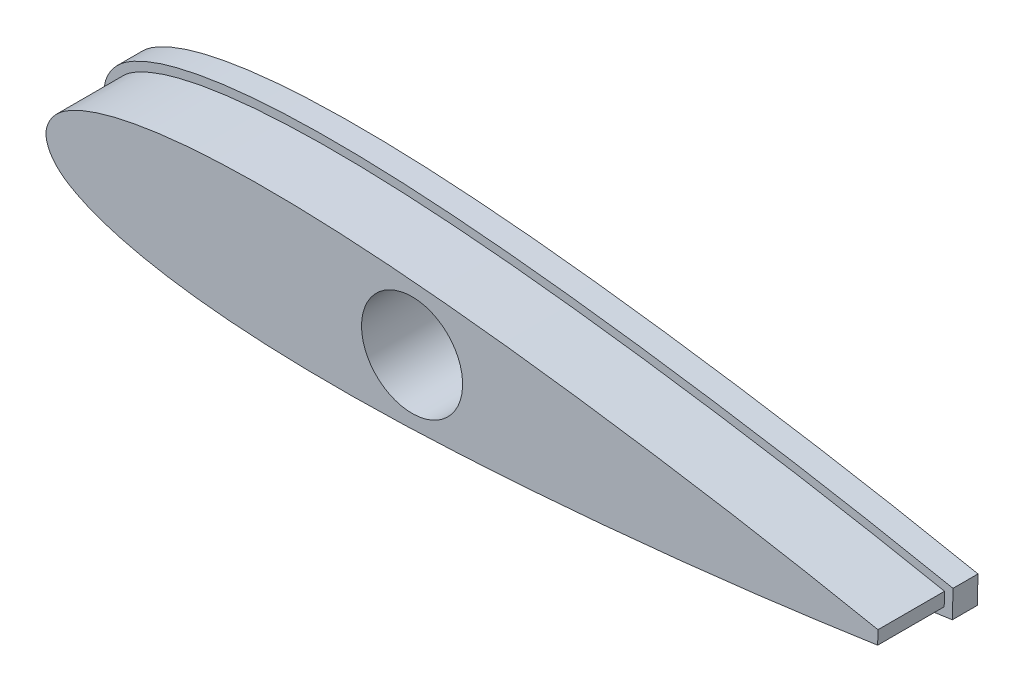
ISO-10303-21;
HEADER;
FILE_DESCRIPTION(('STEP AP214'),'2;1');
FILE_NAME('part.step','',(''),(''),'','','');
FILE_SCHEMA(('AUTOMOTIVE_DESIGN { 1 0 10303 214 1 1 1 1 }'));
ENDSEC;
DATA;
#1=APPLICATION_CONTEXT('core data for automotive mechanical design processes');
#2=APPLICATION_PROTOCOL_DEFINITION('international standard','automotive_design',2000,#1);
#3=PRODUCT_CONTEXT('',#1,'mechanical');
#4=PRODUCT('Part','Part','',(#3));
#5=PRODUCT_RELATED_PRODUCT_CATEGORY('part','',(#4));
#6=PRODUCT_DEFINITION_FORMATION('','',#4);
#7=PRODUCT_DEFINITION_CONTEXT('part definition',#1,'design');
#8=PRODUCT_DEFINITION('design','',#6,#7);
#9=PRODUCT_DEFINITION_SHAPE('','',#8);
#10=(LENGTH_UNIT() NAMED_UNIT(*) SI_UNIT(.MILLI.,.METRE.));
#11=(NAMED_UNIT(*) PLANE_ANGLE_UNIT() SI_UNIT($,.RADIAN.));
#12=(NAMED_UNIT(*) SI_UNIT($,.STERADIAN.) SOLID_ANGLE_UNIT());
#13=UNCERTAINTY_MEASURE_WITH_UNIT(LENGTH_MEASURE(1.E-05),#10,'distance_accuracy_value','');
#14=(GEOMETRIC_REPRESENTATION_CONTEXT(3) GLOBAL_UNCERTAINTY_ASSIGNED_CONTEXT((#13)) GLOBAL_UNIT_ASSIGNED_CONTEXT((#10,
#11,#12)) REPRESENTATION_CONTEXT('',''));
#15=CARTESIAN_POINT('',(0.,0.,0.));
#16=DIRECTION('',(0.,0.,1.));
#17=DIRECTION('',(1.,0.,0.));
#18=AXIS2_PLACEMENT_3D('',#15,#16,#17);
#19=CARTESIAN_POINT('',(50.0391351963758,-0.93465045998398,8.));
#20=CARTESIAN_POINT('',(45.8735654226045,-0.109554208683025,8.));
#21=CARTESIAN_POINT('',(37.5324766993359,1.4914977864518,8.));
#22=CARTESIAN_POINT('',(24.9619659066655,3.57622377755545,8.));
#23=CARTESIAN_POINT('',(12.3528740709345,5.41256621364044,8.));
#24=CARTESIAN_POINT('',(-0.303978478214954,6.93325535590916,8.));
#25=CARTESIAN_POINT('',(-10.9005845501203,7.83790789579574,8.));
#26=CARTESIAN_POINT('',(-19.410170070986,8.20760131311207,8.));
#27=CARTESIAN_POINT('',(-25.8062625672368,8.2564032276951,8.));
#28=CARTESIAN_POINT('',(-31.1435581397761,8.03732263119962,8.));
#29=CARTESIAN_POINT('',(-35.4087615230218,7.6384426647758,8.));
#30=CARTESIAN_POINT('',(-38.6026527514809,7.19302608164895,8.));
#31=CARTESIAN_POINT('',(-41.7752995956353,6.55510114662252,8.));
#32=CARTESIAN_POINT('',(-44.3969141822974,5.79731373428159,8.));
#33=CARTESIAN_POINT('',(-46.4497416142304,4.91218647077529,8.));
#34=CARTESIAN_POINT('',(-47.9189969759881,4.11222674841642,8.));
#35=CARTESIAN_POINT('',(-49.3618619362066,2.8010449640594,8.));
#36=CARTESIAN_POINT('',(-50.2398518230499,0.770607995901365,8.));
#37=CARTESIAN_POINT('',(-49.4651472544591,-1.30143769724024,8.));
#38=CARTESIAN_POINT('',(-48.0900898244585,-2.68356433009845,8.));
#39=CARTESIAN_POINT('',(-46.6629503763209,-3.55644454583241,8.));
#40=CARTESIAN_POINT('',(-44.6572638689059,-4.54375015802786,8.));
#41=CARTESIAN_POINT('',(-42.0771029667931,-5.4324990103534,8.));
#42=CARTESIAN_POINT('',(-38.9405763404005,-6.22926556486122,8.));
#43=CARTESIAN_POINT('',(-35.7731450895972,-6.8348366863545,8.));
#44=CARTESIAN_POINT('',(-31.5334171623615,-7.44783932181592,8.));
#45=CARTESIAN_POINT('',(-26.2139076378241,-7.93521879898396,8.));
#46=CARTESIAN_POINT('',(-19.8234625329192,-8.20833454122373,8.));
#47=CARTESIAN_POINT('',(-11.3060544799891,-8.26731775592366,8.));
#48=CARTESIAN_POINT('',(-0.677350383170464,-7.8970399097958,8.));
#49=CARTESIAN_POINT('',(12.0399894787811,-7.01517894913061,8.));
#50=CARTESIAN_POINT('',(24.7255130284685,-5.81566123988733,8.));
#51=CARTESIAN_POINT('',(37.3850032465093,-4.36613322499501,8.));
#52=CARTESIAN_POINT('',(45.7960907899984,-3.18683897997931,8.));
#53=CARTESIAN_POINT('',(49.9979026684139,-2.57240240678935,8.));
#54=B_SPLINE_CURVE_WITH_KNOTS('',3,(#19,#20,#21,#22,#23,#24,#25,#26,#27,#28,#29,#30,#31,#32,#33,
#34,#35,#36,#37,#38,#39,#40,#41,#42,#43,#44,#45,#46,#47,#48,#49,#50,#51,#52,#53),.UNSPECIFIED.,
.F.,.F.,(4,1,1,1,1,1,1,1,1,1,1,1,1,1,1,1,1,1,1,1,1,1,1,1,1,1,1,1,1,1,1,1,4),
(-0.00328090173750234,0.0596292109796854,0.122539323696873,0.185449436414061,0.248359549131249,
0.311269661848436,0.34272471820703,0.374179774565624,0.405634830924218,0.421362359103515,
0.437089887282812,0.452817415462109,0.468544943641406,0.476408707731054,0.484272471820703,
0.492136235910351,0.5,0.507863764089648,0.515727528179296,0.523591292268945,0.531455056358593,
0.54718258453789,0.562910112717187,0.578637640896484,0.594365169075781,0.625820225434375,
0.657275281792969,0.688730338151563,0.75164045086875,0.814550563585938,0.877460676303126,
0.940370789020314,1.0032809017375),.UNSPECIFIED.);
#55=DIRECTION('',(0.,0.,-1.));
#56=VECTOR('',#55,1.);
#57=SURFACE_OF_LINEAR_EXTRUSION('',#54,#56);
#58=CARTESIAN_POINT('',(50.0391351963758,-0.93465045998398,0.));
#59=CARTESIAN_POINT('',(45.8735654226045,-0.109554208683025,0.));
#60=CARTESIAN_POINT('',(37.5324766993359,1.4914977864518,0.));
#61=CARTESIAN_POINT('',(24.9619659066655,3.57622377755545,0.));
#62=CARTESIAN_POINT('',(12.3528740709345,5.41256621364044,0.));
#63=CARTESIAN_POINT('',(-0.303978478214954,6.93325535590916,0.));
#64=CARTESIAN_POINT('',(-10.9005845501203,7.83790789579574,0.));
#65=CARTESIAN_POINT('',(-19.410170070986,8.20760131311207,0.));
#66=CARTESIAN_POINT('',(-25.8062625672368,8.2564032276951,0.));
#67=CARTESIAN_POINT('',(-31.1435581397761,8.03732263119962,0.));
#68=CARTESIAN_POINT('',(-35.4087615230218,7.6384426647758,0.));
#69=CARTESIAN_POINT('',(-38.6026527514809,7.19302608164895,0.));
#70=CARTESIAN_POINT('',(-41.7752995956353,6.55510114662252,0.));
#71=CARTESIAN_POINT('',(-44.3969141822974,5.79731373428159,0.));
#72=CARTESIAN_POINT('',(-46.4497416142304,4.91218647077529,0.));
#73=CARTESIAN_POINT('',(-47.9189969759881,4.11222674841642,0.));
#74=CARTESIAN_POINT('',(-49.3618619362066,2.8010449640594,0.));
#75=CARTESIAN_POINT('',(-50.2398518230499,0.770607995901365,0.));
#76=CARTESIAN_POINT('',(-49.4651472544591,-1.30143769724024,0.));
#77=CARTESIAN_POINT('',(-48.0900898244585,-2.68356433009845,0.));
#78=CARTESIAN_POINT('',(-46.6629503763209,-3.55644454583241,0.));
#79=CARTESIAN_POINT('',(-44.6572638689059,-4.54375015802786,0.));
#80=CARTESIAN_POINT('',(-42.0771029667931,-5.4324990103534,0.));
#81=CARTESIAN_POINT('',(-38.9405763404005,-6.22926556486122,0.));
#82=CARTESIAN_POINT('',(-35.7731450895972,-6.8348366863545,0.));
#83=CARTESIAN_POINT('',(-31.5334171623615,-7.44783932181592,0.));
#84=CARTESIAN_POINT('',(-26.2139076378241,-7.93521879898396,0.));
#85=CARTESIAN_POINT('',(-19.8234625329192,-8.20833454122373,0.));
#86=CARTESIAN_POINT('',(-11.3060544799891,-8.26731775592366,0.));
#87=CARTESIAN_POINT('',(-0.677350383170464,-7.8970399097958,0.));
#88=CARTESIAN_POINT('',(12.0399894787811,-7.01517894913061,0.));
#89=CARTESIAN_POINT('',(24.7255130284685,-5.81566123988733,0.));
#90=CARTESIAN_POINT('',(37.3850032465093,-4.36613322499501,0.));
#91=CARTESIAN_POINT('',(45.7960907899984,-3.18683897997931,0.));
#92=CARTESIAN_POINT('',(49.9979026684139,-2.57240240678935,0.));
#93=B_SPLINE_CURVE_WITH_KNOTS('',3,(#58,#59,#60,#61,#62,#63,#64,#65,#66,#67,#68,#69,#70,#71,#72,
#73,#74,#75,#76,#77,#78,#79,#80,#81,#82,#83,#84,#85,#86,#87,#88,#89,#90,#91,#92),.UNSPECIFIED.,
.F.,.F.,(4,1,1,1,1,1,1,1,1,1,1,1,1,1,1,1,1,1,1,1,1,1,1,1,1,1,1,1,1,1,1,1,4),
(-0.00328090173750234,0.0596292109796854,0.122539323696873,0.185449436414061,0.248359549131249,
0.311269661848436,0.34272471820703,0.374179774565624,0.405634830924218,0.421362359103515,
0.437089887282812,0.452817415462109,0.468544943641406,0.476408707731054,0.484272471820703,
0.492136235910351,0.5,0.507863764089648,0.515727528179296,0.523591292268945,0.531455056358593,
0.54718258453789,0.562910112717187,0.578637640896484,0.594365169075781,0.625820225434375,
0.657275281792969,0.688730338151563,0.75164045086875,0.814550563585938,0.877460676303126,
0.940370789020314,1.0032809017375),.UNSPECIFIED.);
#94=CARTESIAN_POINT('',(50.0391351963758,-0.93465045998398,0.));
#95=VERTEX_POINT('',#94);
#96=CARTESIAN_POINT('',(49.9979026684139,-2.57240240678935,0.));
#97=VERTEX_POINT('',#96);
#98=EDGE_CURVE('E136',#95,#97,#93,.T.);
#99=ORIENTED_EDGE('',*,*,#98,.T.);
#100=DIRECTION('',(0.,0.,-1.));
#101=VECTOR('',#100,1.);
#102=CARTESIAN_POINT('',(49.9979026684139,-2.57240240678935,8.));
#103=LINE('',#102,#101);
#104=CARTESIAN_POINT('',(49.9979026684139,-2.57240240678935,8.));
#105=VERTEX_POINT('',#104);
#106=EDGE_CURVE('E11',#105,#97,#103,.T.);
#107=ORIENTED_EDGE('',*,*,#106,.F.);
#108=CARTESIAN_POINT('',(50.0391351963758,-0.93465045998398,8.));
#109=VERTEX_POINT('',#108);
#110=EDGE_CURVE('E135',#109,#105,#54,.T.);
#111=ORIENTED_EDGE('',*,*,#110,.F.);
#112=DIRECTION('',(0.,0.,-1.));
#113=VECTOR('',#112,1.);
#114=CARTESIAN_POINT('',(50.0391351963758,-0.93465045998398,8.));
#115=LINE('',#114,#113);
#116=EDGE_CURVE('E49',#109,#95,#115,.T.);
#117=ORIENTED_EDGE('',*,*,#116,.T.);
#118=EDGE_LOOP('',(#99,#107,#111,#117));
#119=FACE_BOUND('',#118,.T.);
#120=ADVANCED_FACE('F39',(#119),#57,.F.);
#121=CARTESIAN_POINT('',(49.9979026684139,-2.57240240678935,8.));
#122=DIRECTION('',(-0.999683227637869,0.0251683209517833,0.));
#123=DIRECTION('',(-0.0251683209517833,-0.999683227637869,0.));
#124=AXIS2_PLACEMENT_3D('',#121,#122,#123);
#125=PLANE('',#124);
#126=DIRECTION('',(0.0251683209517833,0.999683227637869,0.));
#127=VECTOR('',#126,1.);
#128=CARTESIAN_POINT('',(49.9979026684139,-2.57240240678935,0.));
#129=LINE('',#128,#127);
#130=EDGE_CURVE('E127',#97,#95,#129,.T.);
#131=ORIENTED_EDGE('',*,*,#130,.T.);
#132=ORIENTED_EDGE('',*,*,#116,.F.);
#133=DIRECTION('',(0.0251683209517833,0.999683227637869,0.));
#134=VECTOR('',#133,1.);
#135=CARTESIAN_POINT('',(49.9979026684139,-2.57240240678935,8.));
#136=LINE('',#135,#134);
#137=EDGE_CURVE('E55',#105,#109,#136,.T.);
#138=ORIENTED_EDGE('',*,*,#137,.F.);
#139=ORIENTED_EDGE('',*,*,#106,.T.);
#140=EDGE_LOOP('',(#131,#132,#138,#139));
#141=FACE_BOUND('',#140,.T.);
#142=ADVANCED_FACE('F118',(#141),#125,.F.);
#143=CARTESIAN_POINT('',(-49.9644027471442,0.763673208404102,8.));
#144=DIRECTION('',(0.,0.,-1.));
#145=DIRECTION('',(-1.,0.,0.));
#146=AXIS2_PLACEMENT_3D('',#143,#144,#145);
#147=PLANE('',#146);
#148=CARTESIAN_POINT('',(-5.96408597478164,-0.344091795424136,8.));
#149=DIRECTION('',(0.,0.,-1.));
#150=DIRECTION('',(-1.,0.,0.));
#151=AXIS2_PLACEMENT_3D('',#148,#149,#150);
#152=CIRCLE('',#151,6.075);
#153=CARTESIAN_POINT('',(-12.0390859747816,-0.344091795424136,8.));
#154=VERTEX_POINT('',#153);
#155=EDGE_CURVE('E165',#154,#154,#152,.T.);
#156=ORIENTED_EDGE('',*,*,#155,.T.);
#157=EDGE_LOOP('',(#156));
#158=FACE_BOUND('',#157,.T.);
#159=ORIENTED_EDGE('',*,*,#110,.T.);
#160=ORIENTED_EDGE('',*,*,#137,.T.);
#161=EDGE_LOOP('',(#159,#160));
#162=FACE_BOUND('',#161,.T.);
#163=ADVANCED_FACE('F116',(#158,#162),#147,.F.);
#164=CARTESIAN_POINT('',(50.9763778072206,-3.43995392586334,-3.));
#165=DIRECTION('',(0.999683227637867,-0.0251683209518781,0.));
#166=DIRECTION('',(0.0251683209518781,0.999683227637867,0.));
#167=AXIS2_PLACEMENT_3D('',#164,#165,#166);
#168=PLANE('',#167);
#169=DIRECTION('',(0.0251683209518781,0.999683227637867,0.));
#170=VECTOR('',#169,1.);
#171=CARTESIAN_POINT('',(50.9763778072206,-3.43995392586334,0.));
#172=LINE('',#171,#170);
#173=CARTESIAN_POINT('',(50.9763778072206,-3.43995392586334,0.));
#174=VERTEX_POINT('',#173);
#175=CARTESIAN_POINT('',(51.0600265128451,-0.117435582813395,0.));
#176=VERTEX_POINT('',#175);
#177=EDGE_CURVE('E103',#174,#176,#172,.T.);
#178=ORIENTED_EDGE('',*,*,#177,.F.);
#179=DIRECTION('',(0.,0.,1.));
#180=VECTOR('',#179,1.);
#181=CARTESIAN_POINT('',(50.9763778072206,-3.43995392586334,-3.));
#182=LINE('',#181,#180);
#183=CARTESIAN_POINT('',(50.9763778072206,-3.43995392586334,-3.));
#184=VERTEX_POINT('',#183);
#185=EDGE_CURVE('E87',#184,#174,#182,.T.);
#186=ORIENTED_EDGE('',*,*,#185,.F.);
#187=DIRECTION('',(0.0251683209518781,0.999683227637867,0.));
#188=VECTOR('',#187,1.);
#189=CARTESIAN_POINT('',(50.9763778072206,-3.43995392586334,-3.));
#190=LINE('',#189,#188);
#191=CARTESIAN_POINT('',(51.0600265128451,-0.117435582813395,-3.));
#192=VERTEX_POINT('',#191);
#193=EDGE_CURVE('E90',#184,#192,#190,.T.);
#194=ORIENTED_EDGE('',*,*,#193,.T.);
#195=DIRECTION('',(0.,0.,1.));
#196=VECTOR('',#195,1.);
#197=CARTESIAN_POINT('',(51.0600265128451,-0.117435582813395,-3.));
#198=LINE('',#197,#196);
#199=EDGE_CURVE('E76',#192,#176,#198,.T.);
#200=ORIENTED_EDGE('',*,*,#199,.T.);
#201=EDGE_LOOP('',(#178,#186,#194,#200));
#202=FACE_BOUND('',#201,.T.);
#203=ADVANCED_FACE('F91',(#202),#168,.T.);
#204=CARTESIAN_POINT('',(51.0600265128451,-0.117435582813395,-3.));
#205=CARTESIAN_POINT('',(46.8544266036337,0.715589647351116,-3.));
#206=CARTESIAN_POINT('',(38.4380807275689,2.34679184008295,-3.));
#207=CARTESIAN_POINT('',(25.7404153694239,4.46760826361973,-3.));
#208=CARTESIAN_POINT('',(15.1314128770027,6.02291071701665,-3.));
#209=CARTESIAN_POINT('',(6.61494762222156,7.10958835079157,-3.));
#210=CARTESIAN_POINT('',(0.212117257360533,7.83020230808325,-3.));
#211=CARTESIAN_POINT('',(-6.20929231744261,8.4419145817846,-3.));
#212=CARTESIAN_POINT('',(-12.6520727041604,8.91047980558153,-3.));
#213=CARTESIAN_POINT('',(-19.117337495949,9.20063005349927,-3.));
#214=CARTESIAN_POINT('',(-24.5253090824262,9.25039473233348,-3.));
#215=CARTESIAN_POINT('',(-28.8644397069248,9.13229191156246,-3.));
#216=CARTESIAN_POINT('',(-32.1240316343844,8.94717923765351,-3.));
#217=CARTESIAN_POINT('',(-35.3882481480345,8.64789392983394,-3.));
#218=CARTESIAN_POINT('',(-38.6606854664979,8.19823721264595,-3.));
#219=CARTESIAN_POINT('',(-41.3824299555786,7.65688270610097,-3.));
#220=CARTESIAN_POINT('',(-43.5644815794723,7.08024041021188,-3.));
#221=CARTESIAN_POINT('',(-45.2154129914214,6.53148242592686,-3.));
#222=CARTESIAN_POINT('',(-46.8357841620786,5.8367465042228,-3.));
#223=CARTESIAN_POINT('',(-48.4580998456241,4.96853990954121,-3.));
#224=CARTESIAN_POINT('',(-49.8908614402687,3.68404873398529,-3.));
#225=CARTESIAN_POINT('',(-50.737060522199,2.17994184363993,-3.));
#226=CARTESIAN_POINT('',(-51.0600265128451,0.791256956752034,-3.));
#227=CARTESIAN_POINT('',(-50.8073492751129,-0.611920494505411,-3.));
#228=CARTESIAN_POINT('',(-50.0379099398406,-2.15670317604348,-3.));
#229=CARTESIAN_POINT('',(-48.6715999855447,-3.511664605739,-3.));
#230=CARTESIAN_POINT('',(-47.0950283561797,-4.46040733462172,-3.));
#231=CARTESIAN_POINT('',(-45.5116696111095,-5.23580130932925,-3.));
#232=CARTESIAN_POINT('',(-43.8904436296676,-5.86694009705725,-3.));
#233=CARTESIAN_POINT('',(-41.7401734644928,-6.55265420913637,-3.));
#234=CARTESIAN_POINT('',(-39.0491184588123,-7.23028295852633,-3.));
#235=CARTESIAN_POINT('',(-35.8034539936629,-7.84404133627051,-3.));
#236=CARTESIAN_POINT('',(-32.5584331244066,-8.30720513186931,-3.));
#237=CARTESIAN_POINT('',(-29.3122857360281,-8.65610822518516,-3.));
#238=CARTESIAN_POINT('',(-24.984595323559,-8.99240949868446,-3.));
#239=CARTESIAN_POINT('',(-19.5809708421866,-9.21484076383774,-3.));
#240=CARTESIAN_POINT('',(-13.1092962590796,-9.25039473233348,-3.));
#241=CARTESIAN_POINT('',(-6.65109962992515,-9.1066283259506,-3.));
#242=CARTESIAN_POINT('',(-0.207043478969771,-8.81882082690825,-3.));
#243=CARTESIAN_POINT('',(6.2239370084199,-8.42131469180694,-3.));
#244=CARTESIAN_POINT('',(14.7842952246646,-7.76456822229604,-3.));
#245=CARTESIAN_POINT('',(25.4581211940339,-6.74508856023583,-3.));
#246=CARTESIAN_POINT('',(38.246420982562,-5.26591434179021,-3.));
#247=CARTESIAN_POINT('',(46.7341875153534,-4.0602950884804,-3.));
#248=CARTESIAN_POINT('',(50.9763778072206,-3.43995392586334,-3.));
#249=B_SPLINE_CURVE_WITH_KNOTS('',3,(#204,#205,#206,#207,#208,#209,#210,#211,#212,#213,#214,
#215,#216,#217,#218,#219,#220,#221,#222,#223,#224,#225,#226,#227,#228,#229,#230,#231,#232,#233,
#234,#235,#236,#237,#238,#239,#240,#241,#242,#243,#244,#245,#246,#247,#248),.UNSPECIFIED.,.F.,
.F.,(4,1,1,1,1,1,1,1,1,1,1,1,1,1,1,1,1,1,1,1,1,1,1,1,1,1,1,1,1,1,1,1,1,1,1,1,1,1,1,1,1,1,4),
(-0.00744207168561099,0.0559881872750902,0.119418446235791,0.182848705196492,0.214563834676843,
0.246278964157194,0.277994093637544,0.309709223117895,0.341424352598245,0.373139482078596,
0.388997046818771,0.404854611558947,0.420712176299122,0.436569741039297,0.452427305779472,
0.46035608814956,0.468284870519648,0.476213652889735,0.484142435259823,0.492071217629911,
0.496035608814954,0.499999999999998,0.503964391185042,0.507928782370086,0.515857564740174,
0.523786347110261,0.531715129480349,0.539643911850436,0.547572694220524,0.563430258960699,
0.579287823700875,0.59514538844105,0.611002953181225,0.626860517921401,0.658575647401751,
0.690290776882102,0.722005906362452,0.753721035842803,0.785436165323153,0.817151294803504,
0.880581553764205,0.944011812724906,1.00744207168561),.UNSPECIFIED.);
#250=DIRECTION('',(0.,0.,1.));
#251=VECTOR('',#250,1.);
#252=SURFACE_OF_LINEAR_EXTRUSION('',#249,#251);
#253=CARTESIAN_POINT('',(51.0600265128451,-0.117435582813395,0.));
#254=CARTESIAN_POINT('',(46.8544266036337,0.715589647351116,0.));
#255=CARTESIAN_POINT('',(38.4380807275689,2.34679184008295,0.));
#256=CARTESIAN_POINT('',(25.7404153694239,4.46760826361973,0.));
#257=CARTESIAN_POINT('',(15.1314128770027,6.02291071701665,0.));
#258=CARTESIAN_POINT('',(6.61494762222156,7.10958835079157,0.));
#259=CARTESIAN_POINT('',(0.212117257360533,7.83020230808325,0.));
#260=CARTESIAN_POINT('',(-6.20929231744261,8.4419145817846,0.));
#261=CARTESIAN_POINT('',(-12.6520727041604,8.91047980558153,0.));
#262=CARTESIAN_POINT('',(-19.117337495949,9.20063005349927,0.));
#263=CARTESIAN_POINT('',(-24.5253090824262,9.25039473233348,0.));
#264=CARTESIAN_POINT('',(-28.8644397069248,9.13229191156246,0.));
#265=CARTESIAN_POINT('',(-32.1240316343844,8.94717923765351,0.));
#266=CARTESIAN_POINT('',(-35.3882481480345,8.64789392983394,0.));
#267=CARTESIAN_POINT('',(-38.6606854664979,8.19823721264595,0.));
#268=CARTESIAN_POINT('',(-41.3824299555786,7.65688270610097,0.));
#269=CARTESIAN_POINT('',(-43.5644815794723,7.08024041021188,0.));
#270=CARTESIAN_POINT('',(-45.2154129914214,6.53148242592686,0.));
#271=CARTESIAN_POINT('',(-46.8357841620786,5.8367465042228,0.));
#272=CARTESIAN_POINT('',(-48.4580998456241,4.96853990954121,0.));
#273=CARTESIAN_POINT('',(-49.8908614402687,3.68404873398529,0.));
#274=CARTESIAN_POINT('',(-50.737060522199,2.17994184363993,0.));
#275=CARTESIAN_POINT('',(-51.0600265128451,0.791256956752034,0.));
#276=CARTESIAN_POINT('',(-50.8073492751129,-0.611920494505411,0.));
#277=CARTESIAN_POINT('',(-50.0379099398406,-2.15670317604348,0.));
#278=CARTESIAN_POINT('',(-48.6715999855447,-3.511664605739,0.));
#279=CARTESIAN_POINT('',(-47.0950283561797,-4.46040733462172,0.));
#280=CARTESIAN_POINT('',(-45.5116696111095,-5.23580130932925,0.));
#281=CARTESIAN_POINT('',(-43.8904436296676,-5.86694009705725,0.));
#282=CARTESIAN_POINT('',(-41.7401734644928,-6.55265420913637,0.));
#283=CARTESIAN_POINT('',(-39.0491184588123,-7.23028295852633,0.));
#284=CARTESIAN_POINT('',(-35.8034539936629,-7.84404133627051,0.));
#285=CARTESIAN_POINT('',(-32.5584331244066,-8.30720513186931,0.));
#286=CARTESIAN_POINT('',(-29.3122857360281,-8.65610822518516,0.));
#287=CARTESIAN_POINT('',(-24.984595323559,-8.99240949868446,0.));
#288=CARTESIAN_POINT('',(-19.5809708421866,-9.21484076383774,0.));
#289=CARTESIAN_POINT('',(-13.1092962590796,-9.25039473233348,0.));
#290=CARTESIAN_POINT('',(-6.65109962992515,-9.1066283259506,0.));
#291=CARTESIAN_POINT('',(-0.207043478969771,-8.81882082690825,0.));
#292=CARTESIAN_POINT('',(6.2239370084199,-8.42131469180694,0.));
#293=CARTESIAN_POINT('',(14.7842952246646,-7.76456822229604,0.));
#294=CARTESIAN_POINT('',(25.4581211940339,-6.74508856023583,0.));
#295=CARTESIAN_POINT('',(38.246420982562,-5.26591434179021,0.));
#296=CARTESIAN_POINT('',(46.7341875153534,-4.0602950884804,0.));
#297=CARTESIAN_POINT('',(50.9763778072206,-3.43995392586334,0.));
#298=B_SPLINE_CURVE_WITH_KNOTS('',3,(#253,#254,#255,#256,#257,#258,#259,#260,#261,#262,#263,
#264,#265,#266,#267,#268,#269,#270,#271,#272,#273,#274,#275,#276,#277,#278,#279,#280,#281,#282,
#283,#284,#285,#286,#287,#288,#289,#290,#291,#292,#293,#294,#295,#296,#297),.UNSPECIFIED.,.F.,
.F.,(4,1,1,1,1,1,1,1,1,1,1,1,1,1,1,1,1,1,1,1,1,1,1,1,1,1,1,1,1,1,1,1,1,1,1,1,1,1,1,1,1,1,4),
(-0.00744207168561099,0.0559881872750902,0.119418446235791,0.182848705196492,0.214563834676843,
0.246278964157194,0.277994093637544,0.309709223117895,0.341424352598245,0.373139482078596,
0.388997046818771,0.404854611558947,0.420712176299122,0.436569741039297,0.452427305779472,
0.46035608814956,0.468284870519648,0.476213652889735,0.484142435259823,0.492071217629911,
0.496035608814954,0.499999999999998,0.503964391185042,0.507928782370086,0.515857564740174,
0.523786347110261,0.531715129480349,0.539643911850436,0.547572694220524,0.563430258960699,
0.579287823700875,0.59514538844105,0.611002953181225,0.626860517921401,0.658575647401751,
0.690290776882102,0.722005906362452,0.753721035842803,0.785436165323153,0.817151294803504,
0.880581553764205,0.944011812724906,1.00744207168561),.UNSPECIFIED.);
#299=EDGE_CURVE('E82',#176,#174,#298,.T.);
#300=ORIENTED_EDGE('',*,*,#299,.F.);
#301=ORIENTED_EDGE('',*,*,#199,.F.);
#302=EDGE_CURVE('E80',#192,#184,#249,.T.);
#303=ORIENTED_EDGE('',*,*,#302,.T.);
#304=ORIENTED_EDGE('',*,*,#185,.T.);
#305=EDGE_LOOP('',(#300,#301,#303,#304));
#306=FACE_BOUND('',#305,.T.);
#307=ADVANCED_FACE('F78',(#306),#252,.T.);
#308=CARTESIAN_POINT('',(-50.964085974782,0.788841529357123,-3.));
#309=DIRECTION('',(0.,0.,-1.));
#310=DIRECTION('',(-1.,0.,0.));
#311=AXIS2_PLACEMENT_3D('',#308,#309,#310);
#312=PLANE('',#311);
#313=CARTESIAN_POINT('',(-5.96408597478164,-0.344091795424136,-3.));
#314=DIRECTION('',(0.,0.,-1.));
#315=DIRECTION('',(-1.,0.,0.));
#316=AXIS2_PLACEMENT_3D('',#313,#314,#315);
#317=CIRCLE('',#316,6.075);
#318=CARTESIAN_POINT('',(-12.0390859747816,-0.344091795424136,-3.));
#319=VERTEX_POINT('',#318);
#320=EDGE_CURVE('E168',#319,#319,#317,.T.);
#321=ORIENTED_EDGE('',*,*,#320,.F.);
#322=EDGE_LOOP('',(#321));
#323=FACE_BOUND('',#322,.T.);
#324=ORIENTED_EDGE('',*,*,#193,.F.);
#325=ORIENTED_EDGE('',*,*,#302,.F.);
#326=EDGE_LOOP('',(#324,#325));
#327=FACE_BOUND('',#326,.T.);
#328=ADVANCED_FACE('F95',(#323,#327),#312,.T.);
#329=CARTESIAN_POINT('',(-50.964085974782,0.788841529357123,0.));
#330=DIRECTION('',(0.,0.,-1.));
#331=DIRECTION('',(-1.,0.,0.));
#332=AXIS2_PLACEMENT_3D('',#329,#330,#331);
#333=PLANE('',#332);
#334=ORIENTED_EDGE('',*,*,#98,.F.);
#335=ORIENTED_EDGE('',*,*,#130,.F.);
#336=EDGE_LOOP('',(#334,#335));
#337=FACE_BOUND('',#336,.T.);
#338=ORIENTED_EDGE('',*,*,#177,.T.);
#339=ORIENTED_EDGE('',*,*,#299,.T.);
#340=EDGE_LOOP('',(#338,#339));
#341=FACE_BOUND('',#340,.T.);
#342=ADVANCED_FACE('F112',(#337,#341),#333,.F.);
#343=CARTESIAN_POINT('',(-5.96408597478164,-0.344091795424136,27.));
#344=DIRECTION('',(0.,0.,-1.));
#345=DIRECTION('',(-1.,0.,0.));
#346=AXIS2_PLACEMENT_3D('',#343,#344,#345);
#347=CYLINDRICAL_SURFACE('',#346,6.075);
#348=ORIENTED_EDGE('',*,*,#320,.T.);
#349=EDGE_LOOP('',(#348));
#350=FACE_BOUND('',#349,.T.);
#351=ORIENTED_EDGE('',*,*,#155,.F.);
#352=EDGE_LOOP('',(#351));
#353=FACE_BOUND('',#352,.T.);
#354=ADVANCED_FACE('F175',(#350,#353),#347,.F.);
#355=CLOSED_SHELL('',(#120,#142,#163,#203,#307,#328,#342,#354));
#356=MANIFOLD_SOLID_BREP('B2',#355);
#357=ADVANCED_BREP_SHAPE_REPRESENTATION('',(#18,#356),#14);
#358=SHAPE_DEFINITION_REPRESENTATION(#9,#357);
ENDSEC;
END-ISO-10303-21;
